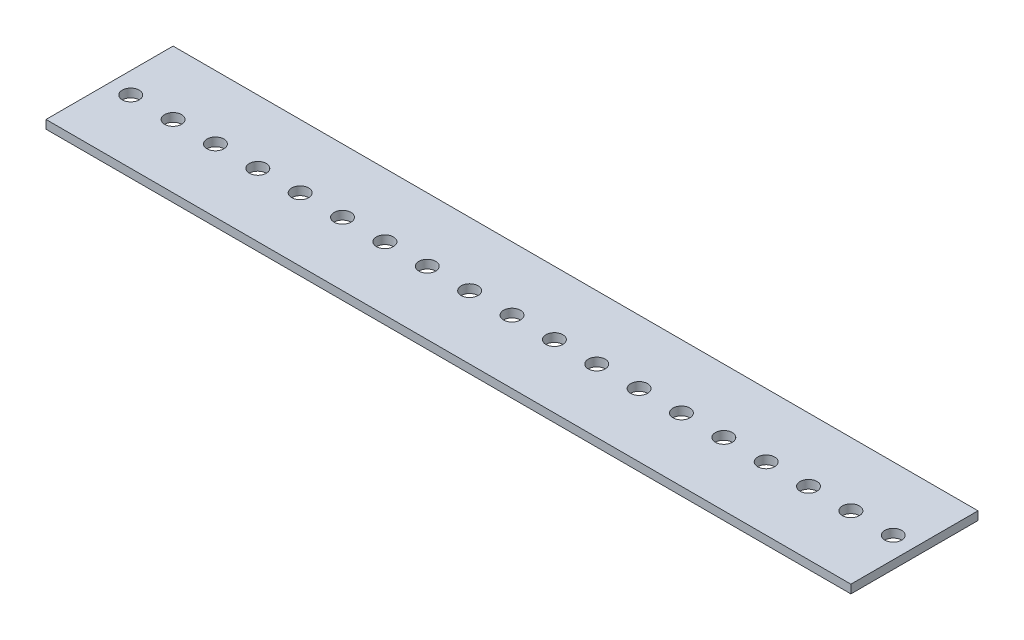
ISO-10303-21;
HEADER;
FILE_DESCRIPTION(('STEP AP214'),'2;1');
FILE_NAME('part.step','',(''),(''),'','','');
FILE_SCHEMA(('AUTOMOTIVE_DESIGN { 1 0 10303 214 1 1 1 1 }'));
ENDSEC;
DATA;
#1=APPLICATION_CONTEXT('core data for automotive mechanical design processes');
#2=APPLICATION_PROTOCOL_DEFINITION('international standard','automotive_design',2000,#1);
#3=PRODUCT_CONTEXT('',#1,'mechanical');
#4=PRODUCT('Part','Part','',(#3));
#5=PRODUCT_RELATED_PRODUCT_CATEGORY('part','',(#4));
#6=PRODUCT_DEFINITION_FORMATION('','',#4);
#7=PRODUCT_DEFINITION_CONTEXT('part definition',#1,'design');
#8=PRODUCT_DEFINITION('design','',#6,#7);
#9=PRODUCT_DEFINITION_SHAPE('','',#8);
#10=(LENGTH_UNIT() NAMED_UNIT(*) SI_UNIT(.MILLI.,.METRE.));
#11=(NAMED_UNIT(*) PLANE_ANGLE_UNIT() SI_UNIT($,.RADIAN.));
#12=(NAMED_UNIT(*) SI_UNIT($,.STERADIAN.) SOLID_ANGLE_UNIT());
#13=UNCERTAINTY_MEASURE_WITH_UNIT(LENGTH_MEASURE(1.E-05),#10,'distance_accuracy_value','');
#14=(GEOMETRIC_REPRESENTATION_CONTEXT(3) GLOBAL_UNCERTAINTY_ASSIGNED_CONTEXT((#13)) GLOBAL_UNIT_ASSIGNED_CONTEXT((#10,
#11,#12)) REPRESENTATION_CONTEXT('',''));
#15=CARTESIAN_POINT('',(0.,0.,0.));
#16=DIRECTION('',(0.,0.,1.));
#17=DIRECTION('',(1.,0.,0.));
#18=AXIS2_PLACEMENT_3D('',#15,#16,#17);
#19=CARTESIAN_POINT('',(114.3,0.,0.));
#20=DIRECTION('',(0.,1.,0.));
#21=DIRECTION('',(0.,0.,1.));
#22=AXIS2_PLACEMENT_3D('',#19,#20,#21);
#23=CYLINDRICAL_SURFACE('',#22,2.54);
#24=CARTESIAN_POINT('',(114.3,0.,0.));
#25=DIRECTION('',(0.,1.,0.));
#26=DIRECTION('',(0.,0.,1.));
#27=AXIS2_PLACEMENT_3D('',#24,#25,#26);
#28=CIRCLE('',#27,2.54);
#29=CARTESIAN_POINT('',(114.3,0.,2.54));
#30=VERTEX_POINT('',#29);
#31=EDGE_CURVE('E45',#30,#30,#28,.T.);
#32=ORIENTED_EDGE('',*,*,#31,.F.);
#33=EDGE_LOOP('',(#32));
#34=FACE_BOUND('',#33,.T.);
#35=CARTESIAN_POINT('',(114.3,2.54,0.));
#36=DIRECTION('',(0.,1.,0.));
#37=DIRECTION('',(0.,0.,1.));
#38=AXIS2_PLACEMENT_3D('',#35,#36,#37);
#39=CIRCLE('',#38,2.54);
#40=CARTESIAN_POINT('',(114.3,2.54,2.54));
#41=VERTEX_POINT('',#40);
#42=EDGE_CURVE('E11',#41,#41,#39,.T.);
#43=ORIENTED_EDGE('',*,*,#42,.T.);
#44=EDGE_LOOP('',(#43));
#45=FACE_BOUND('',#44,.T.);
#46=ADVANCED_FACE('F37',(#34,#45),#23,.F.);
#47=CARTESIAN_POINT('',(101.6,0.,0.));
#48=DIRECTION('',(0.,1.,0.));
#49=DIRECTION('',(0.,0.,1.));
#50=AXIS2_PLACEMENT_3D('',#47,#48,#49);
#51=CYLINDRICAL_SURFACE('',#50,2.54);
#52=CARTESIAN_POINT('',(101.6,0.,0.));
#53=DIRECTION('',(0.,1.,0.));
#54=DIRECTION('',(0.,0.,1.));
#55=AXIS2_PLACEMENT_3D('',#52,#53,#54);
#56=CIRCLE('',#55,2.54);
#57=CARTESIAN_POINT('',(101.6,0.,2.54));
#58=VERTEX_POINT('',#57);
#59=EDGE_CURVE('E205',#58,#58,#56,.T.);
#60=ORIENTED_EDGE('',*,*,#59,.F.);
#61=EDGE_LOOP('',(#60));
#62=FACE_BOUND('',#61,.T.);
#63=CARTESIAN_POINT('',(101.6,2.54,0.));
#64=DIRECTION('',(0.,1.,0.));
#65=DIRECTION('',(0.,0.,1.));
#66=AXIS2_PLACEMENT_3D('',#63,#64,#65);
#67=CIRCLE('',#66,2.54);
#68=CARTESIAN_POINT('',(101.6,2.54,2.54));
#69=VERTEX_POINT('',#68);
#70=EDGE_CURVE('E208',#69,#69,#67,.T.);
#71=ORIENTED_EDGE('',*,*,#70,.T.);
#72=EDGE_LOOP('',(#71));
#73=FACE_BOUND('',#72,.T.);
#74=ADVANCED_FACE('F217',(#62,#73),#51,.F.);
#75=CARTESIAN_POINT('',(88.9,0.,0.));
#76=DIRECTION('',(0.,1.,0.));
#77=DIRECTION('',(0.,0.,1.));
#78=AXIS2_PLACEMENT_3D('',#75,#76,#77);
#79=CYLINDRICAL_SURFACE('',#78,2.54);
#80=CARTESIAN_POINT('',(88.9,0.,0.));
#81=DIRECTION('',(0.,1.,0.));
#82=DIRECTION('',(0.,0.,1.));
#83=AXIS2_PLACEMENT_3D('',#80,#81,#82);
#84=CIRCLE('',#83,2.54);
#85=CARTESIAN_POINT('',(88.9,0.,2.54));
#86=VERTEX_POINT('',#85);
#87=EDGE_CURVE('E199',#86,#86,#84,.T.);
#88=ORIENTED_EDGE('',*,*,#87,.F.);
#89=EDGE_LOOP('',(#88));
#90=FACE_BOUND('',#89,.T.);
#91=CARTESIAN_POINT('',(88.9,2.54,0.));
#92=DIRECTION('',(0.,1.,0.));
#93=DIRECTION('',(0.,0.,1.));
#94=AXIS2_PLACEMENT_3D('',#91,#92,#93);
#95=CIRCLE('',#94,2.54);
#96=CARTESIAN_POINT('',(88.9,2.54,2.54));
#97=VERTEX_POINT('',#96);
#98=EDGE_CURVE('E202',#97,#97,#95,.T.);
#99=ORIENTED_EDGE('',*,*,#98,.T.);
#100=EDGE_LOOP('',(#99));
#101=FACE_BOUND('',#100,.T.);
#102=ADVANCED_FACE('F300',(#90,#101),#79,.F.);
#103=CARTESIAN_POINT('',(76.2,0.,0.));
#104=DIRECTION('',(0.,1.,0.));
#105=DIRECTION('',(0.,0.,1.));
#106=AXIS2_PLACEMENT_3D('',#103,#104,#105);
#107=CYLINDRICAL_SURFACE('',#106,2.54);
#108=CARTESIAN_POINT('',(76.2,0.,0.));
#109=DIRECTION('',(0.,1.,0.));
#110=DIRECTION('',(0.,0.,1.));
#111=AXIS2_PLACEMENT_3D('',#108,#109,#110);
#112=CIRCLE('',#111,2.54);
#113=CARTESIAN_POINT('',(76.2,0.,2.54));
#114=VERTEX_POINT('',#113);
#115=EDGE_CURVE('E193',#114,#114,#112,.T.);
#116=ORIENTED_EDGE('',*,*,#115,.F.);
#117=EDGE_LOOP('',(#116));
#118=FACE_BOUND('',#117,.T.);
#119=CARTESIAN_POINT('',(76.2,2.54,0.));
#120=DIRECTION('',(0.,1.,0.));
#121=DIRECTION('',(0.,0.,1.));
#122=AXIS2_PLACEMENT_3D('',#119,#120,#121);
#123=CIRCLE('',#122,2.54);
#124=CARTESIAN_POINT('',(76.2,2.54,2.54));
#125=VERTEX_POINT('',#124);
#126=EDGE_CURVE('E196',#125,#125,#123,.T.);
#127=ORIENTED_EDGE('',*,*,#126,.T.);
#128=EDGE_LOOP('',(#127));
#129=FACE_BOUND('',#128,.T.);
#130=ADVANCED_FACE('F296',(#118,#129),#107,.F.);
#131=CARTESIAN_POINT('',(63.5,0.,0.));
#132=DIRECTION('',(0.,1.,0.));
#133=DIRECTION('',(0.,0.,1.));
#134=AXIS2_PLACEMENT_3D('',#131,#132,#133);
#135=CYLINDRICAL_SURFACE('',#134,2.54);
#136=CARTESIAN_POINT('',(63.5,0.,0.));
#137=DIRECTION('',(0.,1.,0.));
#138=DIRECTION('',(0.,0.,1.));
#139=AXIS2_PLACEMENT_3D('',#136,#137,#138);
#140=CIRCLE('',#139,2.54);
#141=CARTESIAN_POINT('',(63.5,0.,2.54));
#142=VERTEX_POINT('',#141);
#143=EDGE_CURVE('E187',#142,#142,#140,.T.);
#144=ORIENTED_EDGE('',*,*,#143,.F.);
#145=EDGE_LOOP('',(#144));
#146=FACE_BOUND('',#145,.T.);
#147=CARTESIAN_POINT('',(63.5,2.54,0.));
#148=DIRECTION('',(0.,1.,0.));
#149=DIRECTION('',(0.,0.,1.));
#150=AXIS2_PLACEMENT_3D('',#147,#148,#149);
#151=CIRCLE('',#150,2.54);
#152=CARTESIAN_POINT('',(63.5,2.54,2.54));
#153=VERTEX_POINT('',#152);
#154=EDGE_CURVE('E190',#153,#153,#151,.T.);
#155=ORIENTED_EDGE('',*,*,#154,.T.);
#156=EDGE_LOOP('',(#155));
#157=FACE_BOUND('',#156,.T.);
#158=ADVANCED_FACE('F292',(#146,#157),#135,.F.);
#159=CARTESIAN_POINT('',(50.8,0.,0.));
#160=DIRECTION('',(0.,1.,0.));
#161=DIRECTION('',(0.,0.,1.));
#162=AXIS2_PLACEMENT_3D('',#159,#160,#161);
#163=CYLINDRICAL_SURFACE('',#162,2.54);
#164=CARTESIAN_POINT('',(50.8,0.,0.));
#165=DIRECTION('',(0.,1.,0.));
#166=DIRECTION('',(0.,0.,1.));
#167=AXIS2_PLACEMENT_3D('',#164,#165,#166);
#168=CIRCLE('',#167,2.54);
#169=CARTESIAN_POINT('',(50.8,0.,2.54));
#170=VERTEX_POINT('',#169);
#171=EDGE_CURVE('E181',#170,#170,#168,.T.);
#172=ORIENTED_EDGE('',*,*,#171,.F.);
#173=EDGE_LOOP('',(#172));
#174=FACE_BOUND('',#173,.T.);
#175=CARTESIAN_POINT('',(50.8,2.54,0.));
#176=DIRECTION('',(0.,1.,0.));
#177=DIRECTION('',(0.,0.,1.));
#178=AXIS2_PLACEMENT_3D('',#175,#176,#177);
#179=CIRCLE('',#178,2.54);
#180=CARTESIAN_POINT('',(50.8,2.54,2.54));
#181=VERTEX_POINT('',#180);
#182=EDGE_CURVE('E184',#181,#181,#179,.T.);
#183=ORIENTED_EDGE('',*,*,#182,.T.);
#184=EDGE_LOOP('',(#183));
#185=FACE_BOUND('',#184,.T.);
#186=ADVANCED_FACE('F288',(#174,#185),#163,.F.);
#187=CARTESIAN_POINT('',(38.1,0.,0.));
#188=DIRECTION('',(0.,1.,0.));
#189=DIRECTION('',(0.,0.,1.));
#190=AXIS2_PLACEMENT_3D('',#187,#188,#189);
#191=CYLINDRICAL_SURFACE('',#190,2.54);
#192=CARTESIAN_POINT('',(38.1,0.,0.));
#193=DIRECTION('',(0.,1.,0.));
#194=DIRECTION('',(0.,0.,1.));
#195=AXIS2_PLACEMENT_3D('',#192,#193,#194);
#196=CIRCLE('',#195,2.54);
#197=CARTESIAN_POINT('',(38.1,0.,2.54));
#198=VERTEX_POINT('',#197);
#199=EDGE_CURVE('E175',#198,#198,#196,.T.);
#200=ORIENTED_EDGE('',*,*,#199,.F.);
#201=EDGE_LOOP('',(#200));
#202=FACE_BOUND('',#201,.T.);
#203=CARTESIAN_POINT('',(38.1,2.54,0.));
#204=DIRECTION('',(0.,1.,0.));
#205=DIRECTION('',(0.,0.,1.));
#206=AXIS2_PLACEMENT_3D('',#203,#204,#205);
#207=CIRCLE('',#206,2.54);
#208=CARTESIAN_POINT('',(38.1,2.54,2.54));
#209=VERTEX_POINT('',#208);
#210=EDGE_CURVE('E178',#209,#209,#207,.T.);
#211=ORIENTED_EDGE('',*,*,#210,.T.);
#212=EDGE_LOOP('',(#211));
#213=FACE_BOUND('',#212,.T.);
#214=ADVANCED_FACE('F284',(#202,#213),#191,.F.);
#215=CARTESIAN_POINT('',(25.4,0.,0.));
#216=DIRECTION('',(0.,1.,0.));
#217=DIRECTION('',(0.,0.,1.));
#218=AXIS2_PLACEMENT_3D('',#215,#216,#217);
#219=CYLINDRICAL_SURFACE('',#218,2.54);
#220=CARTESIAN_POINT('',(25.4,0.,0.));
#221=DIRECTION('',(0.,1.,0.));
#222=DIRECTION('',(0.,0.,1.));
#223=AXIS2_PLACEMENT_3D('',#220,#221,#222);
#224=CIRCLE('',#223,2.54);
#225=CARTESIAN_POINT('',(25.4,0.,2.54));
#226=VERTEX_POINT('',#225);
#227=EDGE_CURVE('E169',#226,#226,#224,.T.);
#228=ORIENTED_EDGE('',*,*,#227,.F.);
#229=EDGE_LOOP('',(#228));
#230=FACE_BOUND('',#229,.T.);
#231=CARTESIAN_POINT('',(25.4,2.54,0.));
#232=DIRECTION('',(0.,1.,0.));
#233=DIRECTION('',(0.,0.,1.));
#234=AXIS2_PLACEMENT_3D('',#231,#232,#233);
#235=CIRCLE('',#234,2.54);
#236=CARTESIAN_POINT('',(25.4,2.54,2.54));
#237=VERTEX_POINT('',#236);
#238=EDGE_CURVE('E172',#237,#237,#235,.T.);
#239=ORIENTED_EDGE('',*,*,#238,.T.);
#240=EDGE_LOOP('',(#239));
#241=FACE_BOUND('',#240,.T.);
#242=ADVANCED_FACE('F280',(#230,#241),#219,.F.);
#243=CARTESIAN_POINT('',(12.7,0.,0.));
#244=DIRECTION('',(0.,1.,0.));
#245=DIRECTION('',(0.,0.,1.));
#246=AXIS2_PLACEMENT_3D('',#243,#244,#245);
#247=CYLINDRICAL_SURFACE('',#246,2.54);
#248=CARTESIAN_POINT('',(12.7,0.,0.));
#249=DIRECTION('',(0.,1.,0.));
#250=DIRECTION('',(0.,0.,1.));
#251=AXIS2_PLACEMENT_3D('',#248,#249,#250);
#252=CIRCLE('',#251,2.54);
#253=CARTESIAN_POINT('',(12.7,0.,2.54));
#254=VERTEX_POINT('',#253);
#255=EDGE_CURVE('E163',#254,#254,#252,.T.);
#256=ORIENTED_EDGE('',*,*,#255,.F.);
#257=EDGE_LOOP('',(#256));
#258=FACE_BOUND('',#257,.T.);
#259=CARTESIAN_POINT('',(12.7,2.54,0.));
#260=DIRECTION('',(0.,1.,0.));
#261=DIRECTION('',(0.,0.,1.));
#262=AXIS2_PLACEMENT_3D('',#259,#260,#261);
#263=CIRCLE('',#262,2.54);
#264=CARTESIAN_POINT('',(12.7,2.54,2.54));
#265=VERTEX_POINT('',#264);
#266=EDGE_CURVE('E166',#265,#265,#263,.T.);
#267=ORIENTED_EDGE('',*,*,#266,.T.);
#268=EDGE_LOOP('',(#267));
#269=FACE_BOUND('',#268,.T.);
#270=ADVANCED_FACE('F276',(#258,#269),#247,.F.);
#271=CARTESIAN_POINT('',(0.,0.,0.));
#272=DIRECTION('',(0.,1.,0.));
#273=DIRECTION('',(0.,0.,1.));
#274=AXIS2_PLACEMENT_3D('',#271,#272,#273);
#275=CYLINDRICAL_SURFACE('',#274,2.54);
#276=CARTESIAN_POINT('',(0.,0.,0.));
#277=DIRECTION('',(0.,1.,0.));
#278=DIRECTION('',(0.,0.,1.));
#279=AXIS2_PLACEMENT_3D('',#276,#277,#278);
#280=CIRCLE('',#279,2.54);
#281=CARTESIAN_POINT('',(0.,0.,2.54));
#282=VERTEX_POINT('',#281);
#283=EDGE_CURVE('E157',#282,#282,#280,.T.);
#284=ORIENTED_EDGE('',*,*,#283,.F.);
#285=EDGE_LOOP('',(#284));
#286=FACE_BOUND('',#285,.T.);
#287=CARTESIAN_POINT('',(0.,2.54,0.));
#288=DIRECTION('',(0.,1.,0.));
#289=DIRECTION('',(0.,0.,1.));
#290=AXIS2_PLACEMENT_3D('',#287,#288,#289);
#291=CIRCLE('',#290,2.54);
#292=CARTESIAN_POINT('',(0.,2.54,2.54));
#293=VERTEX_POINT('',#292);
#294=EDGE_CURVE('E160',#293,#293,#291,.T.);
#295=ORIENTED_EDGE('',*,*,#294,.T.);
#296=EDGE_LOOP('',(#295));
#297=FACE_BOUND('',#296,.T.);
#298=ADVANCED_FACE('F272',(#286,#297),#275,.F.);
#299=CARTESIAN_POINT('',(-12.7,0.,0.));
#300=DIRECTION('',(0.,1.,0.));
#301=DIRECTION('',(0.,0.,1.));
#302=AXIS2_PLACEMENT_3D('',#299,#300,#301);
#303=CYLINDRICAL_SURFACE('',#302,2.54);
#304=CARTESIAN_POINT('',(-12.7,0.,0.));
#305=DIRECTION('',(0.,1.,0.));
#306=DIRECTION('',(0.,0.,1.));
#307=AXIS2_PLACEMENT_3D('',#304,#305,#306);
#308=CIRCLE('',#307,2.54);
#309=CARTESIAN_POINT('',(-12.7,0.,2.54));
#310=VERTEX_POINT('',#309);
#311=EDGE_CURVE('E151',#310,#310,#308,.T.);
#312=ORIENTED_EDGE('',*,*,#311,.F.);
#313=EDGE_LOOP('',(#312));
#314=FACE_BOUND('',#313,.T.);
#315=CARTESIAN_POINT('',(-12.7,2.54,0.));
#316=DIRECTION('',(0.,1.,0.));
#317=DIRECTION('',(0.,0.,1.));
#318=AXIS2_PLACEMENT_3D('',#315,#316,#317);
#319=CIRCLE('',#318,2.54);
#320=CARTESIAN_POINT('',(-12.7,2.54,2.54));
#321=VERTEX_POINT('',#320);
#322=EDGE_CURVE('E154',#321,#321,#319,.T.);
#323=ORIENTED_EDGE('',*,*,#322,.T.);
#324=EDGE_LOOP('',(#323));
#325=FACE_BOUND('',#324,.T.);
#326=ADVANCED_FACE('F268',(#314,#325),#303,.F.);
#327=CARTESIAN_POINT('',(-25.4,0.,0.));
#328=DIRECTION('',(0.,1.,0.));
#329=DIRECTION('',(0.,0.,1.));
#330=AXIS2_PLACEMENT_3D('',#327,#328,#329);
#331=CYLINDRICAL_SURFACE('',#330,2.54);
#332=CARTESIAN_POINT('',(-25.4,0.,0.));
#333=DIRECTION('',(0.,1.,0.));
#334=DIRECTION('',(0.,0.,1.));
#335=AXIS2_PLACEMENT_3D('',#332,#333,#334);
#336=CIRCLE('',#335,2.54);
#337=CARTESIAN_POINT('',(-25.4,0.,2.54));
#338=VERTEX_POINT('',#337);
#339=EDGE_CURVE('E145',#338,#338,#336,.T.);
#340=ORIENTED_EDGE('',*,*,#339,.F.);
#341=EDGE_LOOP('',(#340));
#342=FACE_BOUND('',#341,.T.);
#343=CARTESIAN_POINT('',(-25.4,2.54,0.));
#344=DIRECTION('',(0.,1.,0.));
#345=DIRECTION('',(0.,0.,1.));
#346=AXIS2_PLACEMENT_3D('',#343,#344,#345);
#347=CIRCLE('',#346,2.54);
#348=CARTESIAN_POINT('',(-25.4,2.54,2.54));
#349=VERTEX_POINT('',#348);
#350=EDGE_CURVE('E148',#349,#349,#347,.T.);
#351=ORIENTED_EDGE('',*,*,#350,.T.);
#352=EDGE_LOOP('',(#351));
#353=FACE_BOUND('',#352,.T.);
#354=ADVANCED_FACE('F264',(#342,#353),#331,.F.);
#355=CARTESIAN_POINT('',(-38.1,0.,0.));
#356=DIRECTION('',(0.,1.,0.));
#357=DIRECTION('',(0.,0.,1.));
#358=AXIS2_PLACEMENT_3D('',#355,#356,#357);
#359=CYLINDRICAL_SURFACE('',#358,2.54);
#360=CARTESIAN_POINT('',(-38.1,0.,0.));
#361=DIRECTION('',(0.,1.,0.));
#362=DIRECTION('',(0.,0.,1.));
#363=AXIS2_PLACEMENT_3D('',#360,#361,#362);
#364=CIRCLE('',#363,2.54);
#365=CARTESIAN_POINT('',(-38.1,0.,2.54));
#366=VERTEX_POINT('',#365);
#367=EDGE_CURVE('E139',#366,#366,#364,.T.);
#368=ORIENTED_EDGE('',*,*,#367,.F.);
#369=EDGE_LOOP('',(#368));
#370=FACE_BOUND('',#369,.T.);
#371=CARTESIAN_POINT('',(-38.1,2.54,0.));
#372=DIRECTION('',(0.,1.,0.));
#373=DIRECTION('',(0.,0.,1.));
#374=AXIS2_PLACEMENT_3D('',#371,#372,#373);
#375=CIRCLE('',#374,2.54);
#376=CARTESIAN_POINT('',(-38.1,2.54,2.54));
#377=VERTEX_POINT('',#376);
#378=EDGE_CURVE('E142',#377,#377,#375,.T.);
#379=ORIENTED_EDGE('',*,*,#378,.T.);
#380=EDGE_LOOP('',(#379));
#381=FACE_BOUND('',#380,.T.);
#382=ADVANCED_FACE('F260',(#370,#381),#359,.F.);
#383=CARTESIAN_POINT('',(-50.8,0.,0.));
#384=DIRECTION('',(0.,1.,0.));
#385=DIRECTION('',(0.,0.,1.));
#386=AXIS2_PLACEMENT_3D('',#383,#384,#385);
#387=CYLINDRICAL_SURFACE('',#386,2.54);
#388=CARTESIAN_POINT('',(-50.8,0.,0.));
#389=DIRECTION('',(0.,1.,0.));
#390=DIRECTION('',(0.,0.,1.));
#391=AXIS2_PLACEMENT_3D('',#388,#389,#390);
#392=CIRCLE('',#391,2.54);
#393=CARTESIAN_POINT('',(-50.8,0.,2.54));
#394=VERTEX_POINT('',#393);
#395=EDGE_CURVE('E133',#394,#394,#392,.T.);
#396=ORIENTED_EDGE('',*,*,#395,.F.);
#397=EDGE_LOOP('',(#396));
#398=FACE_BOUND('',#397,.T.);
#399=CARTESIAN_POINT('',(-50.8,2.54,0.));
#400=DIRECTION('',(0.,1.,0.));
#401=DIRECTION('',(0.,0.,1.));
#402=AXIS2_PLACEMENT_3D('',#399,#400,#401);
#403=CIRCLE('',#402,2.54);
#404=CARTESIAN_POINT('',(-50.8,2.54,2.54));
#405=VERTEX_POINT('',#404);
#406=EDGE_CURVE('E136',#405,#405,#403,.T.);
#407=ORIENTED_EDGE('',*,*,#406,.T.);
#408=EDGE_LOOP('',(#407));
#409=FACE_BOUND('',#408,.T.);
#410=ADVANCED_FACE('F256',(#398,#409),#387,.F.);
#411=CARTESIAN_POINT('',(-63.5,0.,0.));
#412=DIRECTION('',(0.,1.,0.));
#413=DIRECTION('',(0.,0.,1.));
#414=AXIS2_PLACEMENT_3D('',#411,#412,#413);
#415=CYLINDRICAL_SURFACE('',#414,2.54);
#416=CARTESIAN_POINT('',(-63.5,0.,0.));
#417=DIRECTION('',(0.,1.,0.));
#418=DIRECTION('',(0.,0.,1.));
#419=AXIS2_PLACEMENT_3D('',#416,#417,#418);
#420=CIRCLE('',#419,2.54);
#421=CARTESIAN_POINT('',(-63.5,0.,2.54));
#422=VERTEX_POINT('',#421);
#423=EDGE_CURVE('E127',#422,#422,#420,.T.);
#424=ORIENTED_EDGE('',*,*,#423,.F.);
#425=EDGE_LOOP('',(#424));
#426=FACE_BOUND('',#425,.T.);
#427=CARTESIAN_POINT('',(-63.5,2.54,0.));
#428=DIRECTION('',(0.,1.,0.));
#429=DIRECTION('',(0.,0.,1.));
#430=AXIS2_PLACEMENT_3D('',#427,#428,#429);
#431=CIRCLE('',#430,2.54);
#432=CARTESIAN_POINT('',(-63.5,2.54,2.54));
#433=VERTEX_POINT('',#432);
#434=EDGE_CURVE('E130',#433,#433,#431,.T.);
#435=ORIENTED_EDGE('',*,*,#434,.T.);
#436=EDGE_LOOP('',(#435));
#437=FACE_BOUND('',#436,.T.);
#438=ADVANCED_FACE('F252',(#426,#437),#415,.F.);
#439=CARTESIAN_POINT('',(-76.2,0.,0.));
#440=DIRECTION('',(0.,1.,0.));
#441=DIRECTION('',(0.,0.,1.));
#442=AXIS2_PLACEMENT_3D('',#439,#440,#441);
#443=CYLINDRICAL_SURFACE('',#442,2.54);
#444=CARTESIAN_POINT('',(-76.2,0.,0.));
#445=DIRECTION('',(0.,1.,0.));
#446=DIRECTION('',(0.,0.,1.));
#447=AXIS2_PLACEMENT_3D('',#444,#445,#446);
#448=CIRCLE('',#447,2.54);
#449=CARTESIAN_POINT('',(-76.2,0.,2.54));
#450=VERTEX_POINT('',#449);
#451=EDGE_CURVE('E121',#450,#450,#448,.T.);
#452=ORIENTED_EDGE('',*,*,#451,.F.);
#453=EDGE_LOOP('',(#452));
#454=FACE_BOUND('',#453,.T.);
#455=CARTESIAN_POINT('',(-76.2,2.54,0.));
#456=DIRECTION('',(0.,1.,0.));
#457=DIRECTION('',(0.,0.,1.));
#458=AXIS2_PLACEMENT_3D('',#455,#456,#457);
#459=CIRCLE('',#458,2.54);
#460=CARTESIAN_POINT('',(-76.2,2.54,2.54));
#461=VERTEX_POINT('',#460);
#462=EDGE_CURVE('E124',#461,#461,#459,.T.);
#463=ORIENTED_EDGE('',*,*,#462,.T.);
#464=EDGE_LOOP('',(#463));
#465=FACE_BOUND('',#464,.T.);
#466=ADVANCED_FACE('F248',(#454,#465),#443,.F.);
#467=CARTESIAN_POINT('',(-88.9,0.,0.));
#468=DIRECTION('',(0.,1.,0.));
#469=DIRECTION('',(0.,0.,1.));
#470=AXIS2_PLACEMENT_3D('',#467,#468,#469);
#471=CYLINDRICAL_SURFACE('',#470,2.54);
#472=CARTESIAN_POINT('',(-88.9,0.,0.));
#473=DIRECTION('',(0.,1.,0.));
#474=DIRECTION('',(0.,0.,1.));
#475=AXIS2_PLACEMENT_3D('',#472,#473,#474);
#476=CIRCLE('',#475,2.54);
#477=CARTESIAN_POINT('',(-88.9,0.,2.54));
#478=VERTEX_POINT('',#477);
#479=EDGE_CURVE('E115',#478,#478,#476,.T.);
#480=ORIENTED_EDGE('',*,*,#479,.F.);
#481=EDGE_LOOP('',(#480));
#482=FACE_BOUND('',#481,.T.);
#483=CARTESIAN_POINT('',(-88.9,2.54,0.));
#484=DIRECTION('',(0.,1.,0.));
#485=DIRECTION('',(0.,0.,1.));
#486=AXIS2_PLACEMENT_3D('',#483,#484,#485);
#487=CIRCLE('',#486,2.54);
#488=CARTESIAN_POINT('',(-88.9,2.54,2.54));
#489=VERTEX_POINT('',#488);
#490=EDGE_CURVE('E118',#489,#489,#487,.T.);
#491=ORIENTED_EDGE('',*,*,#490,.T.);
#492=EDGE_LOOP('',(#491));
#493=FACE_BOUND('',#492,.T.);
#494=ADVANCED_FACE('F244',(#482,#493),#471,.F.);
#495=CARTESIAN_POINT('',(120.65,2.54,19.05));
#496=DIRECTION('',(-1.,0.,0.));
#497=DIRECTION('',(0.,0.,1.));
#498=AXIS2_PLACEMENT_3D('',#495,#496,#497);
#499=PLANE('',#498);
#500=DIRECTION('',(0.,0.,-1.));
#501=VECTOR('',#500,1.);
#502=CARTESIAN_POINT('',(120.65,0.,19.05));
#503=LINE('',#502,#501);
#504=CARTESIAN_POINT('',(120.65,0.,19.05));
#505=VERTEX_POINT('',#504);
#506=CARTESIAN_POINT('',(120.65,0.,-19.05));
#507=VERTEX_POINT('',#506);
#508=EDGE_CURVE('E105',#505,#507,#503,.T.);
#509=ORIENTED_EDGE('',*,*,#508,.T.);
#510=DIRECTION('',(0.,-1.,0.));
#511=VECTOR('',#510,1.);
#512=CARTESIAN_POINT('',(120.65,2.54,-19.05));
#513=LINE('',#512,#511);
#514=CARTESIAN_POINT('',(120.65,2.54,-19.05));
#515=VERTEX_POINT('',#514);
#516=EDGE_CURVE('E96',#515,#507,#513,.T.);
#517=ORIENTED_EDGE('',*,*,#516,.F.);
#518=DIRECTION('',(0.,0.,-1.));
#519=VECTOR('',#518,1.);
#520=CARTESIAN_POINT('',(120.65,2.54,19.05));
#521=LINE('',#520,#519);
#522=CARTESIAN_POINT('',(120.65,2.54,19.05));
#523=VERTEX_POINT('',#522);
#524=EDGE_CURVE('E90',#523,#515,#521,.T.);
#525=ORIENTED_EDGE('',*,*,#524,.F.);
#526=DIRECTION('',(0.,-1.,0.));
#527=VECTOR('',#526,1.);
#528=CARTESIAN_POINT('',(120.65,2.54,19.05));
#529=LINE('',#528,#527);
#530=EDGE_CURVE('E101',#523,#505,#529,.T.);
#531=ORIENTED_EDGE('',*,*,#530,.T.);
#532=EDGE_LOOP('',(#509,#517,#525,#531));
#533=FACE_BOUND('',#532,.T.);
#534=ADVANCED_FACE('F241',(#533),#499,.F.);
#535=CARTESIAN_POINT('',(-120.65,2.54,-19.05));
#536=DIRECTION('',(0.,0.,1.));
#537=DIRECTION('',(1.,0.,0.));
#538=AXIS2_PLACEMENT_3D('',#535,#536,#537);
#539=PLANE('',#538);
#540=DIRECTION('',(-1.,0.,0.));
#541=VECTOR('',#540,1.);
#542=CARTESIAN_POINT('',(-120.65,0.,-19.05));
#543=LINE('',#542,#541);
#544=CARTESIAN_POINT('',(-120.65,0.,-19.05));
#545=VERTEX_POINT('',#544);
#546=EDGE_CURVE('E95',#507,#545,#543,.T.);
#547=ORIENTED_EDGE('',*,*,#546,.T.);
#548=DIRECTION('',(0.,-1.,0.));
#549=VECTOR('',#548,1.);
#550=CARTESIAN_POINT('',(-120.65,2.54,-19.05));
#551=LINE('',#550,#549);
#552=CARTESIAN_POINT('',(-120.65,2.54,-19.05));
#553=VERTEX_POINT('',#552);
#554=EDGE_CURVE('E93',#553,#545,#551,.T.);
#555=ORIENTED_EDGE('',*,*,#554,.F.);
#556=DIRECTION('',(-1.,0.,0.));
#557=VECTOR('',#556,1.);
#558=CARTESIAN_POINT('',(-120.65,2.54,-19.05));
#559=LINE('',#558,#557);
#560=EDGE_CURVE('E84',#515,#553,#559,.T.);
#561=ORIENTED_EDGE('',*,*,#560,.F.);
#562=ORIENTED_EDGE('',*,*,#516,.T.);
#563=EDGE_LOOP('',(#547,#555,#561,#562));
#564=FACE_BOUND('',#563,.T.);
#565=ADVANCED_FACE('F94',(#564),#539,.F.);
#566=CARTESIAN_POINT('',(-120.65,2.54,19.05));
#567=DIRECTION('',(1.,0.,0.));
#568=DIRECTION('',(0.,0.,-1.));
#569=AXIS2_PLACEMENT_3D('',#566,#567,#568);
#570=PLANE('',#569);
#571=DIRECTION('',(0.,0.,1.));
#572=VECTOR('',#571,1.);
#573=CARTESIAN_POINT('',(-120.65,0.,19.05));
#574=LINE('',#573,#572);
#575=CARTESIAN_POINT('',(-120.65,0.,19.05));
#576=VERTEX_POINT('',#575);
#577=EDGE_CURVE('E70',#545,#576,#574,.T.);
#578=ORIENTED_EDGE('',*,*,#577,.T.);
#579=DIRECTION('',(0.,-1.,0.));
#580=VECTOR('',#579,1.);
#581=CARTESIAN_POINT('',(-120.65,2.54,19.05));
#582=LINE('',#581,#580);
#583=CARTESIAN_POINT('',(-120.65,2.54,19.05));
#584=VERTEX_POINT('',#583);
#585=EDGE_CURVE('E97',#584,#576,#582,.T.);
#586=ORIENTED_EDGE('',*,*,#585,.F.);
#587=DIRECTION('',(0.,0.,1.));
#588=VECTOR('',#587,1.);
#589=CARTESIAN_POINT('',(-120.65,2.54,19.05));
#590=LINE('',#589,#588);
#591=EDGE_CURVE('E88',#553,#584,#590,.T.);
#592=ORIENTED_EDGE('',*,*,#591,.F.);
#593=ORIENTED_EDGE('',*,*,#554,.T.);
#594=EDGE_LOOP('',(#578,#586,#592,#593));
#595=FACE_BOUND('',#594,.T.);
#596=ADVANCED_FACE('F99',(#595),#570,.F.);
#597=CARTESIAN_POINT('',(-120.65,2.54,19.05));
#598=DIRECTION('',(0.,0.,-1.));
#599=DIRECTION('',(-1.,0.,0.));
#600=AXIS2_PLACEMENT_3D('',#597,#598,#599);
#601=PLANE('',#600);
#602=DIRECTION('',(1.,0.,0.));
#603=VECTOR('',#602,1.);
#604=CARTESIAN_POINT('',(-120.65,0.,19.05));
#605=LINE('',#604,#603);
#606=EDGE_CURVE('E76',#576,#505,#605,.T.);
#607=ORIENTED_EDGE('',*,*,#606,.T.);
#608=ORIENTED_EDGE('',*,*,#530,.F.);
#609=DIRECTION('',(1.,0.,0.));
#610=VECTOR('',#609,1.);
#611=CARTESIAN_POINT('',(-120.65,2.54,19.05));
#612=LINE('',#611,#610);
#613=EDGE_CURVE('E53',#584,#523,#612,.T.);
#614=ORIENTED_EDGE('',*,*,#613,.F.);
#615=ORIENTED_EDGE('',*,*,#585,.T.);
#616=EDGE_LOOP('',(#607,#608,#614,#615));
#617=FACE_BOUND('',#616,.T.);
#618=ADVANCED_FACE('F221',(#617),#601,.F.);
#619=CARTESIAN_POINT('',(0.,2.54,0.));
#620=DIRECTION('',(0.,-1.,0.));
#621=DIRECTION('',(0.,0.,-1.));
#622=AXIS2_PLACEMENT_3D('',#619,#620,#621);
#623=PLANE('',#622);
#624=CARTESIAN_POINT('',(-101.6,2.54,0.));
#625=DIRECTION('',(0.,1.,0.));
#626=DIRECTION('',(0.,0.,1.));
#627=AXIS2_PLACEMENT_3D('',#624,#625,#626);
#628=CIRCLE('',#627,2.54);
#629=CARTESIAN_POINT('',(-101.6,2.54,2.54));
#630=VERTEX_POINT('',#629);
#631=EDGE_CURVE('E519',#630,#630,#628,.T.);
#632=ORIENTED_EDGE('',*,*,#631,.F.);
#633=EDGE_LOOP('',(#632));
#634=FACE_BOUND('',#633,.T.);
#635=CARTESIAN_POINT('',(-114.3,2.54,0.));
#636=DIRECTION('',(0.,1.,0.));
#637=DIRECTION('',(0.,0.,1.));
#638=AXIS2_PLACEMENT_3D('',#635,#636,#637);
#639=CIRCLE('',#638,2.54);
#640=CARTESIAN_POINT('',(-114.3,2.54,2.54));
#641=VERTEX_POINT('',#640);
#642=EDGE_CURVE('E520',#641,#641,#639,.T.);
#643=ORIENTED_EDGE('',*,*,#642,.F.);
#644=EDGE_LOOP('',(#643));
#645=FACE_BOUND('',#644,.T.);
#646=ORIENTED_EDGE('',*,*,#524,.T.);
#647=ORIENTED_EDGE('',*,*,#560,.T.);
#648=ORIENTED_EDGE('',*,*,#591,.T.);
#649=ORIENTED_EDGE('',*,*,#613,.T.);
#650=EDGE_LOOP('',(#646,#647,#648,#649));
#651=FACE_BOUND('',#650,.T.);
#652=ORIENTED_EDGE('',*,*,#490,.F.);
#653=EDGE_LOOP('',(#652));
#654=FACE_BOUND('',#653,.T.);
#655=ORIENTED_EDGE('',*,*,#462,.F.);
#656=EDGE_LOOP('',(#655));
#657=FACE_BOUND('',#656,.T.);
#658=ORIENTED_EDGE('',*,*,#434,.F.);
#659=EDGE_LOOP('',(#658));
#660=FACE_BOUND('',#659,.T.);
#661=ORIENTED_EDGE('',*,*,#406,.F.);
#662=EDGE_LOOP('',(#661));
#663=FACE_BOUND('',#662,.T.);
#664=ORIENTED_EDGE('',*,*,#378,.F.);
#665=EDGE_LOOP('',(#664));
#666=FACE_BOUND('',#665,.T.);
#667=ORIENTED_EDGE('',*,*,#350,.F.);
#668=EDGE_LOOP('',(#667));
#669=FACE_BOUND('',#668,.T.);
#670=ORIENTED_EDGE('',*,*,#322,.F.);
#671=EDGE_LOOP('',(#670));
#672=FACE_BOUND('',#671,.T.);
#673=ORIENTED_EDGE('',*,*,#294,.F.);
#674=EDGE_LOOP('',(#673));
#675=FACE_BOUND('',#674,.T.);
#676=ORIENTED_EDGE('',*,*,#266,.F.);
#677=EDGE_LOOP('',(#676));
#678=FACE_BOUND('',#677,.T.);
#679=ORIENTED_EDGE('',*,*,#238,.F.);
#680=EDGE_LOOP('',(#679));
#681=FACE_BOUND('',#680,.T.);
#682=ORIENTED_EDGE('',*,*,#210,.F.);
#683=EDGE_LOOP('',(#682));
#684=FACE_BOUND('',#683,.T.);
#685=ORIENTED_EDGE('',*,*,#182,.F.);
#686=EDGE_LOOP('',(#685));
#687=FACE_BOUND('',#686,.T.);
#688=ORIENTED_EDGE('',*,*,#154,.F.);
#689=EDGE_LOOP('',(#688));
#690=FACE_BOUND('',#689,.T.);
#691=ORIENTED_EDGE('',*,*,#126,.F.);
#692=EDGE_LOOP('',(#691));
#693=FACE_BOUND('',#692,.T.);
#694=ORIENTED_EDGE('',*,*,#98,.F.);
#695=EDGE_LOOP('',(#694));
#696=FACE_BOUND('',#695,.T.);
#697=ORIENTED_EDGE('',*,*,#70,.F.);
#698=EDGE_LOOP('',(#697));
#699=FACE_BOUND('',#698,.T.);
#700=ORIENTED_EDGE('',*,*,#42,.F.);
#701=EDGE_LOOP('',(#700));
#702=FACE_BOUND('',#701,.T.);
#703=ADVANCED_FACE('F85',(#634,#645,#651,#654,#657,#660,#663,#666,#669,#672,#675,#678,#681,#684,
#687,#690,#693,#696,#699,#702),#623,.F.);
#704=CARTESIAN_POINT('',(0.,0.,0.));
#705=DIRECTION('',(0.,-1.,0.));
#706=DIRECTION('',(0.,0.,-1.));
#707=AXIS2_PLACEMENT_3D('',#704,#705,#706);
#708=PLANE('',#707);
#709=CARTESIAN_POINT('',(-101.6,0.,0.));
#710=DIRECTION('',(0.,1.,0.));
#711=DIRECTION('',(0.,0.,1.));
#712=AXIS2_PLACEMENT_3D('',#709,#710,#711);
#713=CIRCLE('',#712,2.54);
#714=CARTESIAN_POINT('',(-101.6,0.,2.54));
#715=VERTEX_POINT('',#714);
#716=EDGE_CURVE('E517',#715,#715,#713,.T.);
#717=ORIENTED_EDGE('',*,*,#716,.T.);
#718=EDGE_LOOP('',(#717));
#719=FACE_BOUND('',#718,.T.);
#720=CARTESIAN_POINT('',(-114.3,0.,0.));
#721=DIRECTION('',(0.,1.,0.));
#722=DIRECTION('',(0.,0.,1.));
#723=AXIS2_PLACEMENT_3D('',#720,#721,#722);
#724=CIRCLE('',#723,2.54);
#725=CARTESIAN_POINT('',(-114.3,0.,2.54));
#726=VERTEX_POINT('',#725);
#727=EDGE_CURVE('E108',#726,#726,#724,.T.);
#728=ORIENTED_EDGE('',*,*,#727,.T.);
#729=EDGE_LOOP('',(#728));
#730=FACE_BOUND('',#729,.T.);
#731=ORIENTED_EDGE('',*,*,#508,.F.);
#732=ORIENTED_EDGE('',*,*,#606,.F.);
#733=ORIENTED_EDGE('',*,*,#577,.F.);
#734=ORIENTED_EDGE('',*,*,#546,.F.);
#735=EDGE_LOOP('',(#731,#732,#733,#734));
#736=FACE_BOUND('',#735,.T.);
#737=ORIENTED_EDGE('',*,*,#479,.T.);
#738=EDGE_LOOP('',(#737));
#739=FACE_BOUND('',#738,.T.);
#740=ORIENTED_EDGE('',*,*,#451,.T.);
#741=EDGE_LOOP('',(#740));
#742=FACE_BOUND('',#741,.T.);
#743=ORIENTED_EDGE('',*,*,#423,.T.);
#744=EDGE_LOOP('',(#743));
#745=FACE_BOUND('',#744,.T.);
#746=ORIENTED_EDGE('',*,*,#395,.T.);
#747=EDGE_LOOP('',(#746));
#748=FACE_BOUND('',#747,.T.);
#749=ORIENTED_EDGE('',*,*,#367,.T.);
#750=EDGE_LOOP('',(#749));
#751=FACE_BOUND('',#750,.T.);
#752=ORIENTED_EDGE('',*,*,#339,.T.);
#753=EDGE_LOOP('',(#752));
#754=FACE_BOUND('',#753,.T.);
#755=ORIENTED_EDGE('',*,*,#311,.T.);
#756=EDGE_LOOP('',(#755));
#757=FACE_BOUND('',#756,.T.);
#758=ORIENTED_EDGE('',*,*,#283,.T.);
#759=EDGE_LOOP('',(#758));
#760=FACE_BOUND('',#759,.T.);
#761=ORIENTED_EDGE('',*,*,#255,.T.);
#762=EDGE_LOOP('',(#761));
#763=FACE_BOUND('',#762,.T.);
#764=ORIENTED_EDGE('',*,*,#227,.T.);
#765=EDGE_LOOP('',(#764));
#766=FACE_BOUND('',#765,.T.);
#767=ORIENTED_EDGE('',*,*,#199,.T.);
#768=EDGE_LOOP('',(#767));
#769=FACE_BOUND('',#768,.T.);
#770=ORIENTED_EDGE('',*,*,#171,.T.);
#771=EDGE_LOOP('',(#770));
#772=FACE_BOUND('',#771,.T.);
#773=ORIENTED_EDGE('',*,*,#143,.T.);
#774=EDGE_LOOP('',(#773));
#775=FACE_BOUND('',#774,.T.);
#776=ORIENTED_EDGE('',*,*,#115,.T.);
#777=EDGE_LOOP('',(#776));
#778=FACE_BOUND('',#777,.T.);
#779=ORIENTED_EDGE('',*,*,#87,.T.);
#780=EDGE_LOOP('',(#779));
#781=FACE_BOUND('',#780,.T.);
#782=ORIENTED_EDGE('',*,*,#59,.T.);
#783=EDGE_LOOP('',(#782));
#784=FACE_BOUND('',#783,.T.);
#785=ORIENTED_EDGE('',*,*,#31,.T.);
#786=EDGE_LOOP('',(#785));
#787=FACE_BOUND('',#786,.T.);
#788=ADVANCED_FACE('F213',(#719,#730,#736,#739,#742,#745,#748,#751,#754,#757,#760,#763,#766,
#769,#772,#775,#778,#781,#784,#787),#708,.T.);
#789=CARTESIAN_POINT('',(-114.3,0.,0.));
#790=DIRECTION('',(0.,1.,0.));
#791=DIRECTION('',(0.,0.,1.));
#792=AXIS2_PLACEMENT_3D('',#789,#790,#791);
#793=CYLINDRICAL_SURFACE('',#792,2.54);
#794=ORIENTED_EDGE('',*,*,#727,.F.);
#795=EDGE_LOOP('',(#794));
#796=FACE_BOUND('',#795,.T.);
#797=ORIENTED_EDGE('',*,*,#642,.T.);
#798=EDGE_LOOP('',(#797));
#799=FACE_BOUND('',#798,.T.);
#800=ADVANCED_FACE('F228',(#796,#799),#793,.F.);
#801=CARTESIAN_POINT('',(-101.6,0.,0.));
#802=DIRECTION('',(0.,1.,0.));
#803=DIRECTION('',(0.,0.,1.));
#804=AXIS2_PLACEMENT_3D('',#801,#802,#803);
#805=CYLINDRICAL_SURFACE('',#804,2.54);
#806=ORIENTED_EDGE('',*,*,#716,.F.);
#807=EDGE_LOOP('',(#806));
#808=FACE_BOUND('',#807,.T.);
#809=ORIENTED_EDGE('',*,*,#631,.T.);
#810=EDGE_LOOP('',(#809));
#811=FACE_BOUND('',#810,.T.);
#812=ADVANCED_FACE('F401',(#808,#811),#805,.F.);
#813=CLOSED_SHELL('',(#46,#74,#102,#130,#158,#186,#214,#242,#270,#298,#326,#354,#382,#410,#438,
#466,#494,#534,#565,#596,#618,#703,#788,#800,#812));
#814=MANIFOLD_SOLID_BREP('B2',#813);
#815=ADVANCED_BREP_SHAPE_REPRESENTATION('',(#18,#814),#14);
#816=SHAPE_DEFINITION_REPRESENTATION(#9,#815);
ENDSEC;
END-ISO-10303-21;
